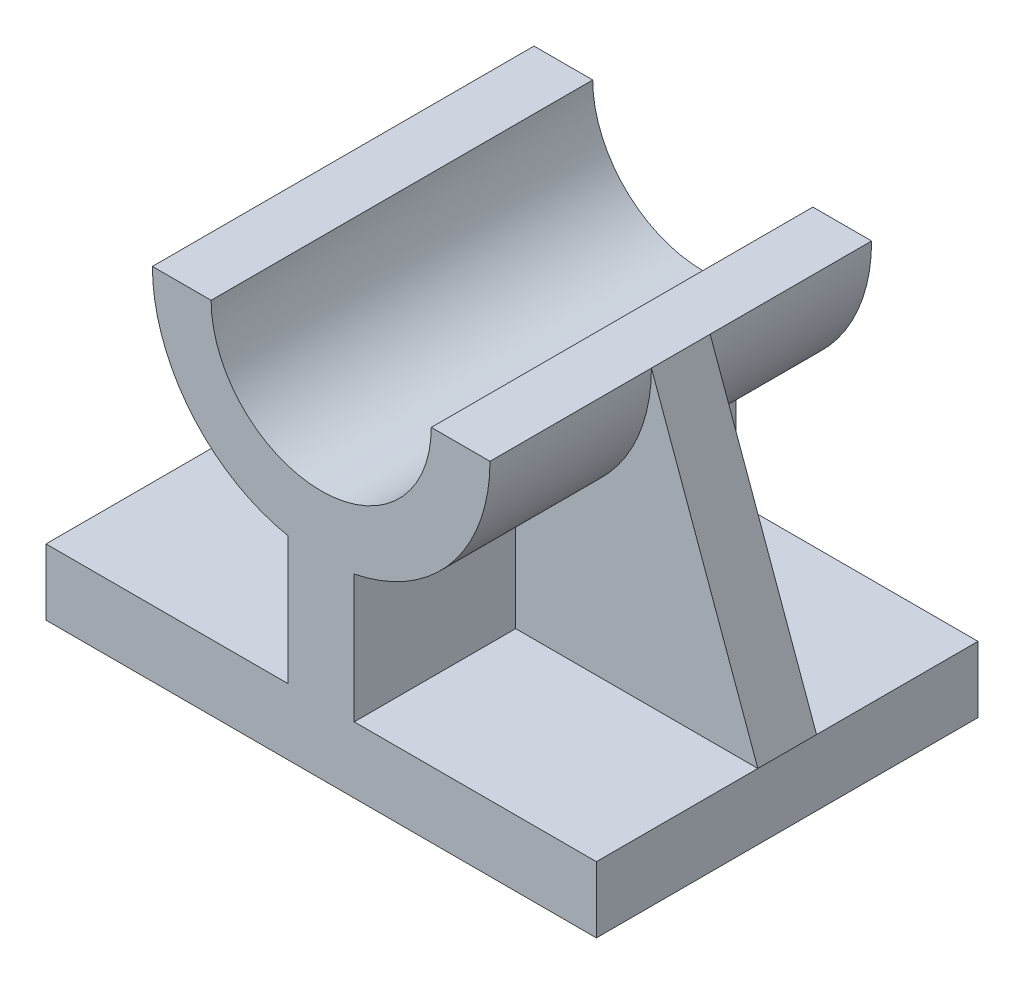
ISO-10303-21;
HEADER;
FILE_DESCRIPTION(('STEP AP214'),'2;1');
FILE_NAME('part.step','',(''),(''),'','','');
FILE_SCHEMA(('AUTOMOTIVE_DESIGN { 1 0 10303 214 1 1 1 1 }'));
ENDSEC;
DATA;
#1=APPLICATION_CONTEXT('core data for automotive mechanical design processes');
#2=APPLICATION_PROTOCOL_DEFINITION('international standard','automotive_design',2000,#1);
#3=PRODUCT_CONTEXT('',#1,'mechanical');
#4=PRODUCT('Part','Part','',(#3));
#5=PRODUCT_RELATED_PRODUCT_CATEGORY('part','',(#4));
#6=PRODUCT_DEFINITION_FORMATION('','',#4);
#7=PRODUCT_DEFINITION_CONTEXT('part definition',#1,'design');
#8=PRODUCT_DEFINITION('design','',#6,#7);
#9=PRODUCT_DEFINITION_SHAPE('','',#8);
#10=(LENGTH_UNIT() NAMED_UNIT(*) SI_UNIT(.MILLI.,.METRE.));
#11=(NAMED_UNIT(*) PLANE_ANGLE_UNIT() SI_UNIT($,.RADIAN.));
#12=(NAMED_UNIT(*) SI_UNIT($,.STERADIAN.) SOLID_ANGLE_UNIT());
#13=UNCERTAINTY_MEASURE_WITH_UNIT(LENGTH_MEASURE(1.E-05),#10,'distance_accuracy_value','');
#14=(GEOMETRIC_REPRESENTATION_CONTEXT(3) GLOBAL_UNCERTAINTY_ASSIGNED_CONTEXT((#13)) GLOBAL_UNIT_ASSIGNED_CONTEXT((#10,
#11,#12)) REPRESENTATION_CONTEXT('',''));
#15=CARTESIAN_POINT('',(0.,0.,0.));
#16=DIRECTION('',(0.,0.,1.));
#17=DIRECTION('',(1.,0.,0.));
#18=AXIS2_PLACEMENT_3D('',#15,#16,#17);
#19=CARTESIAN_POINT('',(0.,9.,0.));
#20=DIRECTION('',(0.,-1.,0.));
#21=DIRECTION('',(0.,0.,-1.));
#22=AXIS2_PLACEMENT_3D('',#19,#20,#21);
#23=PLANE('',#22);
#24=DIRECTION('',(-1.,0.,0.));
#25=VECTOR('',#24,1.);
#26=CARTESIAN_POINT('',(0.,9.,-4.));
#27=LINE('',#26,#25);
#28=CARTESIAN_POINT('',(37.5,9.,-4.));
#29=VERTEX_POINT('',#28);
#30=CARTESIAN_POINT('',(4.5,9.,-4.00000000000001));
#31=VERTEX_POINT('',#30);
#32=EDGE_CURVE('E61',#29,#31,#27,.T.);
#33=ORIENTED_EDGE('',*,*,#32,.F.);
#34=DIRECTION('',(0.,0.,-1.));
#35=VECTOR('',#34,1.);
#36=CARTESIAN_POINT('',(37.5,9.,26.));
#37=LINE('',#36,#35);
#38=CARTESIAN_POINT('',(37.5,9.,-26.));
#39=VERTEX_POINT('',#38);
#40=EDGE_CURVE('E235',#29,#39,#37,.T.);
#41=ORIENTED_EDGE('',*,*,#40,.T.);
#42=DIRECTION('',(-1.,0.,0.));
#43=VECTOR('',#42,1.);
#44=CARTESIAN_POINT('',(-37.5,9.,-26.));
#45=LINE('',#44,#43);
#46=CARTESIAN_POINT('',(4.5,9.,-26.));
#47=VERTEX_POINT('',#46);
#48=EDGE_CURVE('E236',#39,#47,#45,.T.);
#49=ORIENTED_EDGE('',*,*,#48,.T.);
#50=DIRECTION('',(0.,0.,1.));
#51=VECTOR('',#50,1.);
#52=CARTESIAN_POINT('',(4.5,9.,-26.));
#53=LINE('',#52,#51);
#54=EDGE_CURVE('E212',#47,#31,#53,.T.);
#55=ORIENTED_EDGE('',*,*,#54,.T.);
#56=EDGE_LOOP('',(#33,#41,#49,#55));
#57=FACE_BOUND('',#56,.T.);
#58=ADVANCED_FACE('F45',(#57),#23,.F.);
#59=CARTESIAN_POINT('',(0.,49.,-26.));
#60=DIRECTION('',(0.,0.,1.));
#61=DIRECTION('',(1.,0.,0.));
#62=AXIS2_PLACEMENT_3D('',#59,#60,#61);
#63=CYLINDRICAL_SURFACE('',#62,23.);
#64=DIRECTION('',(0.,0.,1.));
#65=VECTOR('',#64,1.);
#66=CARTESIAN_POINT('',(23.,49.,-26.));
#67=LINE('',#66,#65);
#68=CARTESIAN_POINT('',(23.,49.,-26.));
#69=VERTEX_POINT('',#68);
#70=CARTESIAN_POINT('',(23.,49.,-4.));
#71=VERTEX_POINT('',#70);
#72=EDGE_CURVE('E184',#69,#71,#67,.T.);
#73=ORIENTED_EDGE('',*,*,#72,.T.);
#74=CARTESIAN_POINT('',(0.,49.,-4.));
#75=DIRECTION('',(0.,0.,1.));
#76=DIRECTION('',(1.,0.,0.));
#77=AXIS2_PLACEMENT_3D('',#74,#75,#76);
#78=CIRCLE('',#77,23.);
#79=CARTESIAN_POINT('',(4.5,26.4445128627201,-4.));
#80=VERTEX_POINT('',#79);
#81=EDGE_CURVE('E159',#71,#80,#78,.F.);
#82=ORIENTED_EDGE('',*,*,#81,.T.);
#83=DIRECTION('',(0.,0.,1.));
#84=VECTOR('',#83,1.);
#85=CARTESIAN_POINT('',(4.5,26.4445128627201,-26.));
#86=LINE('',#85,#84);
#87=CARTESIAN_POINT('',(4.5,26.4445128627201,-26.));
#88=VERTEX_POINT('',#87);
#89=EDGE_CURVE('E201',#88,#80,#86,.T.);
#90=ORIENTED_EDGE('',*,*,#89,.F.);
#91=CARTESIAN_POINT('',(0.,49.,-26.));
#92=DIRECTION('',(0.,0.,1.));
#93=DIRECTION('',(1.,0.,0.));
#94=AXIS2_PLACEMENT_3D('',#91,#92,#93);
#95=CIRCLE('',#94,23.);
#96=EDGE_CURVE('E192',#88,#69,#95,.T.);
#97=ORIENTED_EDGE('',*,*,#96,.T.);
#98=EDGE_LOOP('',(#73,#82,#90,#97));
#99=FACE_BOUND('',#98,.T.);
#100=ADVANCED_FACE('F190',(#99),#63,.T.);
#101=CARTESIAN_POINT('',(4.5,0.,-26.));
#102=DIRECTION('',(1.,0.,0.));
#103=DIRECTION('',(0.,0.,-1.));
#104=AXIS2_PLACEMENT_3D('',#101,#102,#103);
#105=PLANE('',#104);
#106=ORIENTED_EDGE('',*,*,#89,.T.);
#107=DIRECTION('',(0.,-1.,0.));
#108=VECTOR('',#107,1.);
#109=CARTESIAN_POINT('',(4.5,0.,-4.));
#110=LINE('',#109,#108);
#111=EDGE_CURVE('E163',#80,#31,#110,.T.);
#112=ORIENTED_EDGE('',*,*,#111,.T.);
#113=ORIENTED_EDGE('',*,*,#54,.F.);
#114=DIRECTION('',(0.,1.,0.));
#115=VECTOR('',#114,1.);
#116=CARTESIAN_POINT('',(4.5,0.,-26.));
#117=LINE('',#116,#115);
#118=EDGE_CURVE('E348',#47,#88,#117,.T.);
#119=ORIENTED_EDGE('',*,*,#118,.T.);
#120=EDGE_LOOP('',(#106,#112,#113,#119));
#121=FACE_BOUND('',#120,.T.);
#122=ADVANCED_FACE('F481',(#121),#105,.T.);
#123=DIRECTION('',(1.,0.,0.));
#124=VECTOR('',#123,1.);
#125=CARTESIAN_POINT('',(-37.5,9.,26.));
#126=LINE('',#125,#124);
#127=CARTESIAN_POINT('',(-37.5,9.,26.));
#128=VERTEX_POINT('',#127);
#129=CARTESIAN_POINT('',(-4.5,9.,26.));
#130=VERTEX_POINT('',#129);
#131=EDGE_CURVE('E244',#128,#130,#126,.T.);
#132=ORIENTED_EDGE('',*,*,#131,.T.);
#133=DIRECTION('',(0.,0.,1.));
#134=VECTOR('',#133,1.);
#135=CARTESIAN_POINT('',(-4.5,9.,-26.));
#136=LINE('',#135,#134);
#137=CARTESIAN_POINT('',(-4.5,9.,-26.));
#138=VERTEX_POINT('',#137);
#139=EDGE_CURVE('E217',#138,#130,#136,.T.);
#140=ORIENTED_EDGE('',*,*,#139,.F.);
#141=CARTESIAN_POINT('',(-37.5,9.,-26.));
#142=VERTEX_POINT('',#141);
#143=EDGE_CURVE('E234',#138,#142,#45,.T.);
#144=ORIENTED_EDGE('',*,*,#143,.T.);
#145=DIRECTION('',(0.,0.,1.));
#146=VECTOR('',#145,1.);
#147=CARTESIAN_POINT('',(-37.5,9.,26.));
#148=LINE('',#147,#146);
#149=EDGE_CURVE('E240',#142,#128,#148,.T.);
#150=ORIENTED_EDGE('',*,*,#149,.T.);
#151=EDGE_LOOP('',(#132,#140,#144,#150));
#152=FACE_BOUND('',#151,.T.);
#153=ADVANCED_FACE('F477',(#152),#23,.F.);
#154=CARTESIAN_POINT('',(37.5,9.,26.));
#155=DIRECTION('',(-1.,0.,0.));
#156=DIRECTION('',(0.,0.,1.));
#157=AXIS2_PLACEMENT_3D('',#154,#155,#156);
#158=PLANE('',#157);
#159=DIRECTION('',(0.,0.,-1.));
#160=VECTOR('',#159,1.);
#161=CARTESIAN_POINT('',(37.5,0.,26.));
#162=LINE('',#161,#160);
#163=CARTESIAN_POINT('',(37.5,0.,26.));
#164=VERTEX_POINT('',#163);
#165=CARTESIAN_POINT('',(37.5,0.,-26.));
#166=VERTEX_POINT('',#165);
#167=EDGE_CURVE('E197',#164,#166,#162,.T.);
#168=ORIENTED_EDGE('',*,*,#167,.T.);
#169=DIRECTION('',(0.,-1.,0.));
#170=VECTOR('',#169,1.);
#171=CARTESIAN_POINT('',(37.5,9.,-26.));
#172=LINE('',#171,#170);
#173=EDGE_CURVE('E11',#39,#166,#172,.T.);
#174=ORIENTED_EDGE('',*,*,#173,.F.);
#175=ORIENTED_EDGE('',*,*,#40,.F.);
#176=DIRECTION('',(0.,0.,-1.));
#177=VECTOR('',#176,1.);
#178=CARTESIAN_POINT('',(37.5,9.,0.));
#179=LINE('',#178,#177);
#180=CARTESIAN_POINT('',(37.5,9.,4.));
#181=VERTEX_POINT('',#180);
#182=EDGE_CURVE('E177',#29,#181,#179,.F.);
#183=ORIENTED_EDGE('',*,*,#182,.T.);
#184=CARTESIAN_POINT('',(37.5,9.,26.));
#185=VERTEX_POINT('',#184);
#186=EDGE_CURVE('E230',#185,#181,#37,.T.);
#187=ORIENTED_EDGE('',*,*,#186,.F.);
#188=DIRECTION('',(0.,-1.,0.));
#189=VECTOR('',#188,1.);
#190=CARTESIAN_POINT('',(37.5,9.,26.));
#191=LINE('',#190,#189);
#192=EDGE_CURVE('E248',#185,#164,#191,.T.);
#193=ORIENTED_EDGE('',*,*,#192,.T.);
#194=EDGE_LOOP('',(#168,#174,#175,#183,#187,#193));
#195=FACE_BOUND('',#194,.T.);
#196=ADVANCED_FACE('F47',(#195),#158,.F.);
#197=CARTESIAN_POINT('',(-37.5,9.,-26.));
#198=DIRECTION('',(0.,0.,1.));
#199=DIRECTION('',(1.,0.,0.));
#200=AXIS2_PLACEMENT_3D('',#197,#198,#199);
#201=PLANE('',#200);
#202=DIRECTION('',(-1.,0.,0.));
#203=VECTOR('',#202,1.);
#204=CARTESIAN_POINT('',(-37.5,0.,-26.));
#205=LINE('',#204,#203);
#206=CARTESIAN_POINT('',(-37.5,0.,-26.));
#207=VERTEX_POINT('',#206);
#208=EDGE_CURVE('E251',#166,#207,#205,.T.);
#209=ORIENTED_EDGE('',*,*,#208,.T.);
#210=DIRECTION('',(0.,-1.,0.));
#211=VECTOR('',#210,1.);
#212=CARTESIAN_POINT('',(-37.5,9.,-26.));
#213=LINE('',#212,#211);
#214=EDGE_CURVE('E54',#142,#207,#213,.T.);
#215=ORIENTED_EDGE('',*,*,#214,.F.);
#216=ORIENTED_EDGE('',*,*,#143,.F.);
#217=DIRECTION('',(0.,1.,0.));
#218=VECTOR('',#217,1.);
#219=CARTESIAN_POINT('',(-4.5,0.,-26.));
#220=LINE('',#219,#218);
#221=CARTESIAN_POINT('',(-4.5,26.4445128627201,-26.));
#222=VERTEX_POINT('',#221);
#223=EDGE_CURVE('E353',#138,#222,#220,.T.);
#224=ORIENTED_EDGE('',*,*,#223,.T.);
#225=CARTESIAN_POINT('',(0.,49.,-26.));
#226=DIRECTION('',(0.,0.,1.));
#227=DIRECTION('',(1.,0.,0.));
#228=AXIS2_PLACEMENT_3D('',#225,#226,#227);
#229=CIRCLE('',#228,23.);
#230=CARTESIAN_POINT('',(-23.,49.,-26.));
#231=VERTEX_POINT('',#230);
#232=EDGE_CURVE('E358',#231,#222,#229,.T.);
#233=ORIENTED_EDGE('',*,*,#232,.F.);
#234=DIRECTION('',(1.,0.,0.));
#235=VECTOR('',#234,1.);
#236=CARTESIAN_POINT('',(0.,49.,-26.));
#237=LINE('',#236,#235);
#238=CARTESIAN_POINT('',(-15.,49.,-26.));
#239=VERTEX_POINT('',#238);
#240=EDGE_CURVE('E364',#231,#239,#237,.T.);
#241=ORIENTED_EDGE('',*,*,#240,.T.);
#242=CARTESIAN_POINT('',(0.,49.,-26.));
#243=DIRECTION('',(0.,0.,1.));
#244=DIRECTION('',(1.,0.,0.));
#245=AXIS2_PLACEMENT_3D('',#242,#243,#244);
#246=CIRCLE('',#245,15.);
#247=CARTESIAN_POINT('',(15.,49.,-26.));
#248=VERTEX_POINT('',#247);
#249=EDGE_CURVE('E369',#239,#248,#246,.T.);
#250=ORIENTED_EDGE('',*,*,#249,.T.);
#251=DIRECTION('',(1.,0.,0.));
#252=VECTOR('',#251,1.);
#253=CARTESIAN_POINT('',(0.,49.,-26.));
#254=LINE('',#253,#252);
#255=EDGE_CURVE('E229',#248,#69,#254,.T.);
#256=ORIENTED_EDGE('',*,*,#255,.T.);
#257=ORIENTED_EDGE('',*,*,#96,.F.);
#258=ORIENTED_EDGE('',*,*,#118,.F.);
#259=ORIENTED_EDGE('',*,*,#48,.F.);
#260=ORIENTED_EDGE('',*,*,#173,.T.);
#261=EDGE_LOOP('',(#209,#215,#216,#224,#233,#241,#250,#256,#257,#258,#259,#260));
#262=FACE_BOUND('',#261,.T.);
#263=ADVANCED_FACE('F478',(#262),#201,.F.);
#264=CARTESIAN_POINT('',(-37.5,9.,26.));
#265=DIRECTION('',(1.,0.,0.));
#266=DIRECTION('',(0.,0.,-1.));
#267=AXIS2_PLACEMENT_3D('',#264,#265,#266);
#268=PLANE('',#267);
#269=DIRECTION('',(0.,-1.,0.));
#270=VECTOR('',#269,1.);
#271=CARTESIAN_POINT('',(-37.5,9.,26.));
#272=LINE('',#271,#270);
#273=CARTESIAN_POINT('',(-37.5,0.,26.));
#274=VERTEX_POINT('',#273);
#275=EDGE_CURVE('E263',#128,#274,#272,.T.);
#276=ORIENTED_EDGE('',*,*,#275,.F.);
#277=ORIENTED_EDGE('',*,*,#149,.F.);
#278=ORIENTED_EDGE('',*,*,#214,.T.);
#279=DIRECTION('',(0.,0.,1.));
#280=VECTOR('',#279,1.);
#281=CARTESIAN_POINT('',(-37.5,0.,26.));
#282=LINE('',#281,#280);
#283=EDGE_CURVE('E254',#207,#274,#282,.T.);
#284=ORIENTED_EDGE('',*,*,#283,.T.);
#285=EDGE_LOOP('',(#276,#277,#278,#284));
#286=FACE_BOUND('',#285,.T.);
#287=ADVANCED_FACE('F274',(#286),#268,.F.);
#288=CARTESIAN_POINT('',(-37.5,9.,26.));
#289=DIRECTION('',(0.,0.,-1.));
#290=DIRECTION('',(-1.,0.,0.));
#291=AXIS2_PLACEMENT_3D('',#288,#289,#290);
#292=PLANE('',#291);
#293=DIRECTION('',(1.,0.,0.));
#294=VECTOR('',#293,1.);
#295=CARTESIAN_POINT('',(-37.5,0.,26.));
#296=LINE('',#295,#294);
#297=EDGE_CURVE('E257',#274,#164,#296,.T.);
#298=ORIENTED_EDGE('',*,*,#297,.T.);
#299=ORIENTED_EDGE('',*,*,#192,.F.);
#300=CARTESIAN_POINT('',(4.5,9.,26.));
#301=VERTEX_POINT('',#300);
#302=EDGE_CURVE('E243',#301,#185,#126,.T.);
#303=ORIENTED_EDGE('',*,*,#302,.F.);
#304=DIRECTION('',(0.,1.,0.));
#305=VECTOR('',#304,1.);
#306=CARTESIAN_POINT('',(4.5,0.,26.));
#307=LINE('',#306,#305);
#308=CARTESIAN_POINT('',(4.5,26.4445128627201,26.));
#309=VERTEX_POINT('',#308);
#310=EDGE_CURVE('E386',#301,#309,#307,.T.);
#311=ORIENTED_EDGE('',*,*,#310,.T.);
#312=CARTESIAN_POINT('',(0.,49.,26.));
#313=DIRECTION('',(0.,0.,1.));
#314=DIRECTION('',(1.,0.,0.));
#315=AXIS2_PLACEMENT_3D('',#312,#313,#314);
#316=CIRCLE('',#315,23.);
#317=CARTESIAN_POINT('',(23.,49.,26.));
#318=VERTEX_POINT('',#317);
#319=EDGE_CURVE('E380',#309,#318,#316,.T.);
#320=ORIENTED_EDGE('',*,*,#319,.T.);
#321=DIRECTION('',(1.,0.,0.));
#322=VECTOR('',#321,1.);
#323=CARTESIAN_POINT('',(0.,49.,26.));
#324=LINE('',#323,#322);
#325=CARTESIAN_POINT('',(15.,49.,26.));
#326=VERTEX_POINT('',#325);
#327=EDGE_CURVE('E375',#326,#318,#324,.T.);
#328=ORIENTED_EDGE('',*,*,#327,.F.);
#329=CARTESIAN_POINT('',(0.,49.,26.));
#330=DIRECTION('',(0.,0.,1.));
#331=DIRECTION('',(1.,0.,0.));
#332=AXIS2_PLACEMENT_3D('',#329,#330,#331);
#333=CIRCLE('',#332,15.);
#334=CARTESIAN_POINT('',(-15.,49.,26.));
#335=VERTEX_POINT('',#334);
#336=EDGE_CURVE('E409',#335,#326,#333,.T.);
#337=ORIENTED_EDGE('',*,*,#336,.F.);
#338=DIRECTION('',(1.,0.,0.));
#339=VECTOR('',#338,1.);
#340=CARTESIAN_POINT('',(0.,49.,26.));
#341=LINE('',#340,#339);
#342=CARTESIAN_POINT('',(-23.,49.,26.));
#343=VERTEX_POINT('',#342);
#344=EDGE_CURVE('E403',#343,#335,#341,.T.);
#345=ORIENTED_EDGE('',*,*,#344,.F.);
#346=CARTESIAN_POINT('',(0.,49.,26.));
#347=DIRECTION('',(0.,0.,1.));
#348=DIRECTION('',(1.,0.,0.));
#349=AXIS2_PLACEMENT_3D('',#346,#347,#348);
#350=CIRCLE('',#349,23.);
#351=CARTESIAN_POINT('',(-4.5,26.4445128627201,26.));
#352=VERTEX_POINT('',#351);
#353=EDGE_CURVE('E397',#343,#352,#350,.T.);
#354=ORIENTED_EDGE('',*,*,#353,.T.);
#355=DIRECTION('',(0.,1.,0.));
#356=VECTOR('',#355,1.);
#357=CARTESIAN_POINT('',(-4.5,0.,26.));
#358=LINE('',#357,#356);
#359=EDGE_CURVE('E391',#130,#352,#358,.T.);
#360=ORIENTED_EDGE('',*,*,#359,.F.);
#361=ORIENTED_EDGE('',*,*,#131,.F.);
#362=ORIENTED_EDGE('',*,*,#275,.T.);
#363=EDGE_LOOP('',(#298,#299,#303,#311,#320,#328,#337,#345,#354,#360,#361,#362));
#364=FACE_BOUND('',#363,.T.);
#365=ADVANCED_FACE('F284',(#364),#292,.F.);
#366=ORIENTED_EDGE('',*,*,#186,.T.);
#367=DIRECTION('',(-1.,0.,0.));
#368=VECTOR('',#367,1.);
#369=CARTESIAN_POINT('',(0.,9.,4.));
#370=LINE('',#369,#368);
#371=CARTESIAN_POINT('',(4.5,9.,4.));
#372=VERTEX_POINT('',#371);
#373=EDGE_CURVE('E292',#181,#372,#370,.T.);
#374=ORIENTED_EDGE('',*,*,#373,.T.);
#375=EDGE_CURVE('E69',#372,#301,#53,.T.);
#376=ORIENTED_EDGE('',*,*,#375,.T.);
#377=ORIENTED_EDGE('',*,*,#302,.T.);
#378=EDGE_LOOP('',(#366,#374,#376,#377));
#379=FACE_BOUND('',#378,.T.);
#380=ADVANCED_FACE('F291',(#379),#23,.F.);
#381=CARTESIAN_POINT('',(0.,0.,0.));
#382=DIRECTION('',(0.,-1.,0.));
#383=DIRECTION('',(0.,0.,-1.));
#384=AXIS2_PLACEMENT_3D('',#381,#382,#383);
#385=PLANE('',#384);
#386=ORIENTED_EDGE('',*,*,#297,.F.);
#387=ORIENTED_EDGE('',*,*,#283,.F.);
#388=ORIENTED_EDGE('',*,*,#208,.F.);
#389=ORIENTED_EDGE('',*,*,#167,.F.);
#390=EDGE_LOOP('',(#386,#387,#388,#389));
#391=FACE_BOUND('',#390,.T.);
#392=ADVANCED_FACE('F280',(#391),#385,.T.);
#393=CARTESIAN_POINT('',(0.,49.,-26.));
#394=DIRECTION('',(0.,0.,1.));
#395=DIRECTION('',(1.,0.,0.));
#396=AXIS2_PLACEMENT_3D('',#393,#394,#395);
#397=CYLINDRICAL_SURFACE('',#396,15.);
#398=ORIENTED_EDGE('',*,*,#336,.T.);
#399=DIRECTION('',(0.,0.,1.));
#400=VECTOR('',#399,1.);
#401=CARTESIAN_POINT('',(15.,49.,-26.));
#402=LINE('',#401,#400);
#403=EDGE_CURVE('E194',#248,#326,#402,.T.);
#404=ORIENTED_EDGE('',*,*,#403,.F.);
#405=ORIENTED_EDGE('',*,*,#249,.F.);
#406=DIRECTION('',(0.,0.,1.));
#407=VECTOR('',#406,1.);
#408=CARTESIAN_POINT('',(-15.,49.,-26.));
#409=LINE('',#408,#407);
#410=EDGE_CURVE('E226',#239,#335,#409,.T.);
#411=ORIENTED_EDGE('',*,*,#410,.T.);
#412=EDGE_LOOP('',(#398,#404,#405,#411));
#413=FACE_BOUND('',#412,.T.);
#414=ADVANCED_FACE('F461',(#413),#397,.F.);
#415=CARTESIAN_POINT('',(0.,49.,-26.));
#416=DIRECTION('',(0.,-1.,0.));
#417=DIRECTION('',(0.,0.,-1.));
#418=AXIS2_PLACEMENT_3D('',#415,#416,#417);
#419=PLANE('',#418);
#420=CARTESIAN_POINT('',(23.,49.,4.));
#421=VERTEX_POINT('',#420);
#422=EDGE_CURVE('E187',#421,#318,#67,.T.);
#423=ORIENTED_EDGE('',*,*,#422,.F.);
#424=EDGE_CURVE('E174',#71,#421,#67,.T.);
#425=ORIENTED_EDGE('',*,*,#424,.F.);
#426=ORIENTED_EDGE('',*,*,#72,.F.);
#427=ORIENTED_EDGE('',*,*,#255,.F.);
#428=ORIENTED_EDGE('',*,*,#403,.T.);
#429=ORIENTED_EDGE('',*,*,#327,.T.);
#430=EDGE_LOOP('',(#423,#425,#426,#427,#428,#429));
#431=FACE_BOUND('',#430,.T.);
#432=ADVANCED_FACE('F183',(#431),#419,.F.);
#433=CARTESIAN_POINT('',(0.,49.,4.));
#434=DIRECTION('',(0.,0.,1.));
#435=DIRECTION('',(1.,0.,0.));
#436=AXIS2_PLACEMENT_3D('',#433,#434,#435);
#437=CIRCLE('',#436,23.);
#438=CARTESIAN_POINT('',(4.5,26.4445128627201,4.));
#439=VERTEX_POINT('',#438);
#440=EDGE_CURVE('E428',#421,#439,#437,.F.);
#441=ORIENTED_EDGE('',*,*,#440,.F.);
#442=ORIENTED_EDGE('',*,*,#422,.T.);
#443=ORIENTED_EDGE('',*,*,#319,.F.);
#444=EDGE_CURVE('E207',#439,#309,#86,.T.);
#445=ORIENTED_EDGE('',*,*,#444,.F.);
#446=EDGE_LOOP('',(#441,#442,#443,#445));
#447=FACE_BOUND('',#446,.T.);
#448=ADVANCED_FACE('F453',(#447),#63,.T.);
#449=DIRECTION('',(0.,-1.,0.));
#450=VECTOR('',#449,1.);
#451=CARTESIAN_POINT('',(4.5,0.,4.));
#452=LINE('',#451,#450);
#453=EDGE_CURVE('E423',#439,#372,#452,.T.);
#454=ORIENTED_EDGE('',*,*,#453,.F.);
#455=ORIENTED_EDGE('',*,*,#444,.T.);
#456=ORIENTED_EDGE('',*,*,#310,.F.);
#457=ORIENTED_EDGE('',*,*,#375,.F.);
#458=EDGE_LOOP('',(#454,#455,#456,#457));
#459=FACE_BOUND('',#458,.T.);
#460=ADVANCED_FACE('F455',(#459),#105,.T.);
#461=CARTESIAN_POINT('',(-4.5,0.,-26.));
#462=DIRECTION('',(1.,0.,0.));
#463=DIRECTION('',(0.,0.,-1.));
#464=AXIS2_PLACEMENT_3D('',#461,#462,#463);
#465=PLANE('',#464);
#466=ORIENTED_EDGE('',*,*,#359,.T.);
#467=DIRECTION('',(0.,0.,1.));
#468=VECTOR('',#467,1.);
#469=CARTESIAN_POINT('',(-4.5,26.4445128627201,-26.));
#470=LINE('',#469,#468);
#471=EDGE_CURVE('E220',#222,#352,#470,.T.);
#472=ORIENTED_EDGE('',*,*,#471,.F.);
#473=ORIENTED_EDGE('',*,*,#223,.F.);
#474=ORIENTED_EDGE('',*,*,#139,.T.);
#475=EDGE_LOOP('',(#466,#472,#473,#474));
#476=FACE_BOUND('',#475,.T.);
#477=ADVANCED_FACE('F474',(#476),#465,.F.);
#478=CARTESIAN_POINT('',(0.,49.,-26.));
#479=DIRECTION('',(0.,0.,1.));
#480=DIRECTION('',(1.,0.,0.));
#481=AXIS2_PLACEMENT_3D('',#478,#479,#480);
#482=CYLINDRICAL_SURFACE('',#481,23.);
#483=ORIENTED_EDGE('',*,*,#353,.F.);
#484=DIRECTION('',(0.,0.,1.));
#485=VECTOR('',#484,1.);
#486=CARTESIAN_POINT('',(-23.,49.,-26.));
#487=LINE('',#486,#485);
#488=EDGE_CURVE('E223',#231,#343,#487,.T.);
#489=ORIENTED_EDGE('',*,*,#488,.F.);
#490=ORIENTED_EDGE('',*,*,#232,.T.);
#491=ORIENTED_EDGE('',*,*,#471,.T.);
#492=EDGE_LOOP('',(#483,#489,#490,#491));
#493=FACE_BOUND('',#492,.T.);
#494=ADVANCED_FACE('F470',(#493),#482,.T.);
#495=CARTESIAN_POINT('',(0.,49.,-26.));
#496=DIRECTION('',(0.,-1.,0.));
#497=DIRECTION('',(0.,0.,-1.));
#498=AXIS2_PLACEMENT_3D('',#495,#496,#497);
#499=PLANE('',#498);
#500=ORIENTED_EDGE('',*,*,#344,.T.);
#501=ORIENTED_EDGE('',*,*,#410,.F.);
#502=ORIENTED_EDGE('',*,*,#240,.F.);
#503=ORIENTED_EDGE('',*,*,#488,.T.);
#504=EDGE_LOOP('',(#500,#501,#502,#503));
#505=FACE_BOUND('',#504,.T.);
#506=ADVANCED_FACE('F466',(#505),#499,.F.);
#507=CARTESIAN_POINT('',(23.,49.,0.));
#508=DIRECTION('',(-0.940136065162483,-0.3407993236214,0.));
#509=DIRECTION('',(0.3407993236214,-0.940136065162483,0.));
#510=AXIS2_PLACEMENT_3D('',#507,#508,#509);
#511=PLANE('',#510);
#512=ORIENTED_EDGE('',*,*,#182,.F.);
#513=DIRECTION('',(0.3407993236214,-0.940136065162483,0.));
#514=VECTOR('',#513,1.);
#515=CARTESIAN_POINT('',(23.,49.,-4.));
#516=LINE('',#515,#514);
#517=EDGE_CURVE('E162',#71,#29,#516,.T.);
#518=ORIENTED_EDGE('',*,*,#517,.F.);
#519=ORIENTED_EDGE('',*,*,#424,.T.);
#520=DIRECTION('',(0.3407993236214,-0.940136065162483,0.));
#521=VECTOR('',#520,1.);
#522=CARTESIAN_POINT('',(23.,49.,4.));
#523=LINE('',#522,#521);
#524=EDGE_CURVE('E168',#421,#181,#523,.T.);
#525=ORIENTED_EDGE('',*,*,#524,.T.);
#526=EDGE_LOOP('',(#512,#518,#519,#525));
#527=FACE_BOUND('',#526,.T.);
#528=ADVANCED_FACE('F172',(#527),#511,.F.);
#529=CARTESIAN_POINT('',(0.,24.5,4.));
#530=DIRECTION('',(0.,0.,1.));
#531=DIRECTION('',(1.,0.,0.));
#532=AXIS2_PLACEMENT_3D('',#529,#530,#531);
#533=PLANE('',#532);
#534=ORIENTED_EDGE('',*,*,#373,.F.);
#535=ORIENTED_EDGE('',*,*,#524,.F.);
#536=ORIENTED_EDGE('',*,*,#440,.T.);
#537=ORIENTED_EDGE('',*,*,#453,.T.);
#538=EDGE_LOOP('',(#534,#535,#536,#537));
#539=FACE_BOUND('',#538,.T.);
#540=ADVANCED_FACE('F450',(#539),#533,.T.);
#541=CARTESIAN_POINT('',(0.,24.5,-4.));
#542=DIRECTION('',(0.,0.,1.));
#543=DIRECTION('',(1.,0.,0.));
#544=AXIS2_PLACEMENT_3D('',#541,#542,#543);
#545=PLANE('',#544);
#546=ORIENTED_EDGE('',*,*,#517,.T.);
#547=ORIENTED_EDGE('',*,*,#32,.T.);
#548=ORIENTED_EDGE('',*,*,#111,.F.);
#549=ORIENTED_EDGE('',*,*,#81,.F.);
#550=EDGE_LOOP('',(#546,#547,#548,#549));
#551=FACE_BOUND('',#550,.T.);
#552=ADVANCED_FACE('F161',(#551),#545,.F.);
#553=CLOSED_SHELL('',(#58,#100,#122,#153,#196,#263,#287,#365,#380,#392,#414,#432,#448,#460,#477,
#494,#506,#528,#540,#552));
#554=MANIFOLD_SOLID_BREP('B2',#553);
#555=ADVANCED_BREP_SHAPE_REPRESENTATION('',(#18,#554),#14);
#556=SHAPE_DEFINITION_REPRESENTATION(#9,#555);
ENDSEC;
END-ISO-10303-21;
